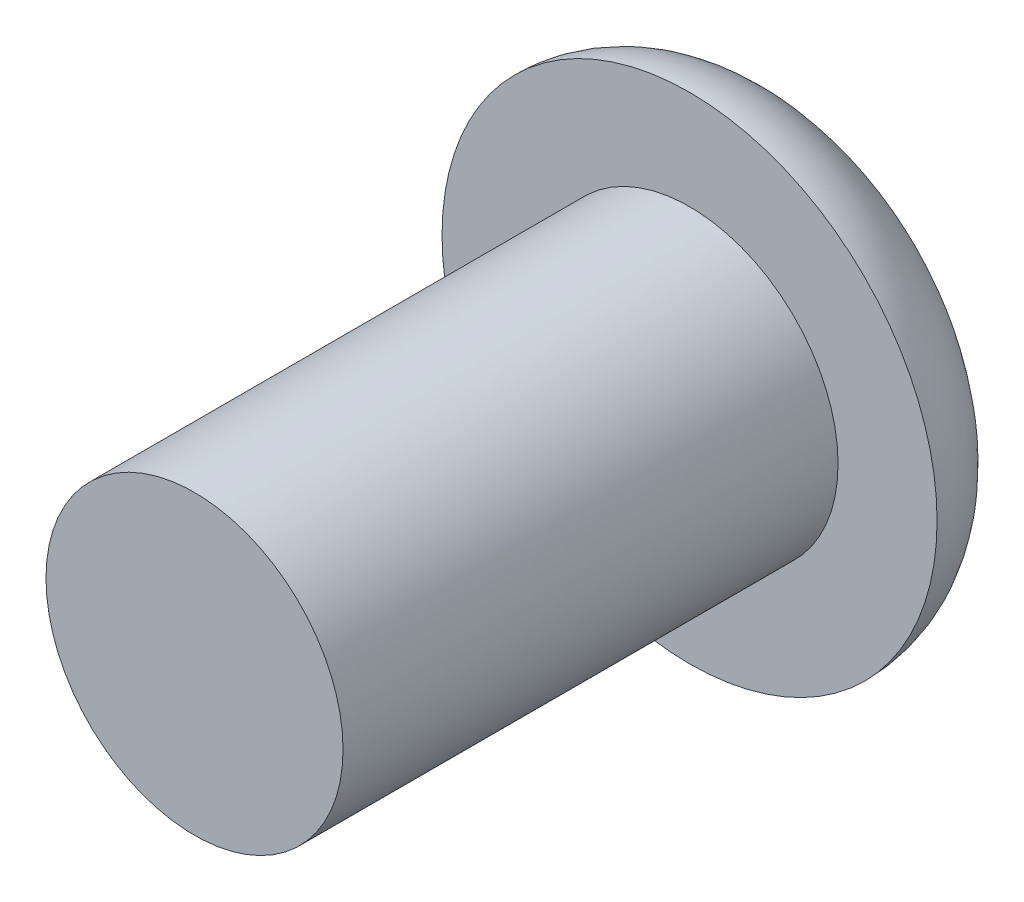
ISO-10303-21;
HEADER;
FILE_DESCRIPTION(('STEP AP214'),'2;1');
FILE_NAME('part.step','',(''),(''),'','','');
FILE_SCHEMA(('AUTOMOTIVE_DESIGN { 1 0 10303 214 1 1 1 1 }'));
ENDSEC;
DATA;
#1=APPLICATION_CONTEXT('core data for automotive mechanical design processes');
#2=APPLICATION_PROTOCOL_DEFINITION('international standard','automotive_design',2000,#1);
#3=PRODUCT_CONTEXT('',#1,'mechanical');
#4=PRODUCT('Part','Part','',(#3));
#5=PRODUCT_RELATED_PRODUCT_CATEGORY('part','',(#4));
#6=PRODUCT_DEFINITION_FORMATION('','',#4);
#7=PRODUCT_DEFINITION_CONTEXT('part definition',#1,'design');
#8=PRODUCT_DEFINITION('design','',#6,#7);
#9=PRODUCT_DEFINITION_SHAPE('','',#8);
#10=(LENGTH_UNIT() NAMED_UNIT(*) SI_UNIT(.MILLI.,.METRE.));
#11=(NAMED_UNIT(*) PLANE_ANGLE_UNIT() SI_UNIT($,.RADIAN.));
#12=(NAMED_UNIT(*) SI_UNIT($,.STERADIAN.) SOLID_ANGLE_UNIT());
#13=UNCERTAINTY_MEASURE_WITH_UNIT(LENGTH_MEASURE(1.E-05),#10,'distance_accuracy_value','');
#14=(GEOMETRIC_REPRESENTATION_CONTEXT(3) GLOBAL_UNCERTAINTY_ASSIGNED_CONTEXT((#13)) GLOBAL_UNIT_ASSIGNED_CONTEXT((#10,
#11,#12)) REPRESENTATION_CONTEXT('',''));
#15=CARTESIAN_POINT('',(0.,0.,0.));
#16=DIRECTION('',(0.,0.,1.));
#17=DIRECTION('',(1.,0.,0.));
#18=AXIS2_PLACEMENT_3D('',#15,#16,#17);
#19=CARTESIAN_POINT('',(0.,0.,2.));
#20=DIRECTION('',(0.,0.,1.));
#21=DIRECTION('',(1.,0.,0.));
#22=AXIS2_PLACEMENT_3D('',#19,#20,#21);
#23=PLANE('',#22);
#24=CARTESIAN_POINT('',(0.,0.,2.));
#25=DIRECTION('',(0.,0.,1.));
#26=DIRECTION('',(1.,0.,0.));
#27=AXIS2_PLACEMENT_3D('',#24,#25,#26);
#28=CIRCLE('',#27,5.);
#29=CARTESIAN_POINT('',(5.,0.,2.));
#30=VERTEX_POINT('',#29);
#31=EDGE_CURVE('E37',#30,#30,#28,.T.);
#32=ORIENTED_EDGE('',*,*,#31,.T.);
#33=EDGE_LOOP('',(#32));
#34=FACE_BOUND('',#33,.T.);
#35=CARTESIAN_POINT('',(0.,0.,2.));
#36=DIRECTION('',(0.,0.,1.));
#37=DIRECTION('',(1.,0.,0.));
#38=AXIS2_PLACEMENT_3D('',#35,#36,#37);
#39=CIRCLE('',#38,3.);
#40=CARTESIAN_POINT('',(3.,0.,2.));
#41=VERTEX_POINT('',#40);
#42=EDGE_CURVE('E45',#41,#41,#39,.T.);
#43=ORIENTED_EDGE('',*,*,#42,.F.);
#44=EDGE_LOOP('',(#43));
#45=FACE_BOUND('',#44,.T.);
#46=ADVANCED_FACE('F31',(#34,#45),#23,.T.);
#47=CARTESIAN_POINT('',(0.,0.,0.));
#48=DIRECTION('',(0.,0.,1.));
#49=DIRECTION('',(1.,0.,0.));
#50=AXIS2_PLACEMENT_3D('',#47,#48,#49);
#51=PLANE('',#50);
#52=CARTESIAN_POINT('',(0.,0.,0.));
#53=DIRECTION('',(0.,0.,1.));
#54=DIRECTION('',(1.,0.,0.));
#55=AXIS2_PLACEMENT_3D('',#52,#53,#54);
#56=CIRCLE('',#55,3.);
#57=CARTESIAN_POINT('',(3.,0.,0.));
#58=VERTEX_POINT('',#57);
#59=EDGE_CURVE('E10',#58,#58,#56,.F.);
#60=ORIENTED_EDGE('',*,*,#59,.T.);
#61=EDGE_LOOP('',(#60));
#62=FACE_BOUND('',#61,.T.);
#63=ADVANCED_FACE('F54',(#62),#51,.F.);
#64=CARTESIAN_POINT('',(0.,0.,12.));
#65=DIRECTION('',(0.,0.,-1.));
#66=DIRECTION('',(-1.,0.,0.));
#67=AXIS2_PLACEMENT_3D('',#64,#65,#66);
#68=CYLINDRICAL_SURFACE('',#67,3.);
#69=CARTESIAN_POINT('',(0.,0.,12.));
#70=DIRECTION('',(0.,0.,1.));
#71=DIRECTION('',(1.,0.,0.));
#72=AXIS2_PLACEMENT_3D('',#69,#70,#71);
#73=CIRCLE('',#72,3.);
#74=CARTESIAN_POINT('',(3.,0.,12.));
#75=VERTEX_POINT('',#74);
#76=EDGE_CURVE('E41',#75,#75,#73,.T.);
#77=ORIENTED_EDGE('',*,*,#76,.F.);
#78=EDGE_LOOP('',(#77));
#79=FACE_BOUND('',#78,.T.);
#80=ORIENTED_EDGE('',*,*,#42,.T.);
#81=EDGE_LOOP('',(#80));
#82=FACE_BOUND('',#81,.T.);
#83=ADVANCED_FACE('F51',(#79,#82),#68,.T.);
#84=CARTESIAN_POINT('',(0.,0.,12.));
#85=DIRECTION('',(0.,0.,1.));
#86=DIRECTION('',(1.,0.,0.));
#87=AXIS2_PLACEMENT_3D('',#84,#85,#86);
#88=PLANE('',#87);
#89=ORIENTED_EDGE('',*,*,#76,.T.);
#90=EDGE_LOOP('',(#89));
#91=FACE_BOUND('',#90,.T.);
#92=ADVANCED_FACE('F61',(#91),#88,.T.);
#93=CARTESIAN_POINT('',(0.,0.,2.));
#94=DIRECTION('',(0.,0.,1.));
#95=DIRECTION('',(1.,0.,0.));
#96=AXIS2_PLACEMENT_3D('',#93,#94,#95);
#97=TOROIDAL_SURFACE('',#96,3.,2.);
#98=ORIENTED_EDGE('',*,*,#59,.F.);
#99=EDGE_LOOP('',(#98));
#100=FACE_BOUND('',#99,.T.);
#101=ORIENTED_EDGE('',*,*,#31,.F.);
#102=EDGE_LOOP('',(#101));
#103=FACE_BOUND('',#102,.T.);
#104=ADVANCED_FACE('F67',(#100,#103),#97,.T.);
#105=CLOSED_SHELL('',(#46,#63,#83,#92,#104));
#106=MANIFOLD_SOLID_BREP('B2',#105);
#107=ADVANCED_BREP_SHAPE_REPRESENTATION('',(#18,#106),#14);
#108=SHAPE_DEFINITION_REPRESENTATION(#9,#107);
ENDSEC;
END-ISO-10303-21;
